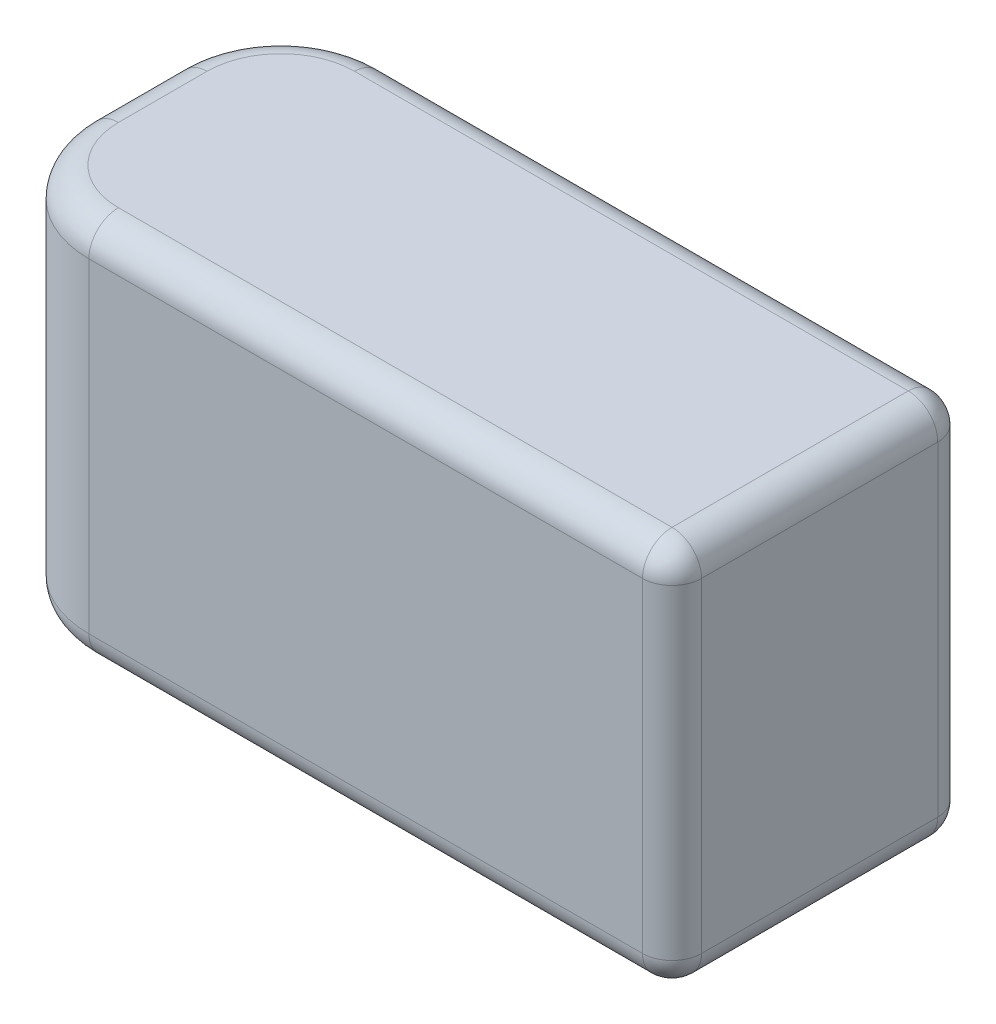
ISO-10303-21;
HEADER;
FILE_DESCRIPTION(('STEP AP214'),'2;1');
FILE_NAME('part.step','',(''),(''),'','','');
FILE_SCHEMA(('AUTOMOTIVE_DESIGN { 1 0 10303 214 1 1 1 1 }'));
ENDSEC;
DATA;
#1=APPLICATION_CONTEXT('core data for automotive mechanical design processes');
#2=APPLICATION_PROTOCOL_DEFINITION('international standard','automotive_design',2000,#1);
#3=PRODUCT_CONTEXT('',#1,'mechanical');
#4=PRODUCT('Part','Part','',(#3));
#5=PRODUCT_RELATED_PRODUCT_CATEGORY('part','',(#4));
#6=PRODUCT_DEFINITION_FORMATION('','',#4);
#7=PRODUCT_DEFINITION_CONTEXT('part definition',#1,'design');
#8=PRODUCT_DEFINITION('design','',#6,#7);
#9=PRODUCT_DEFINITION_SHAPE('','',#8);
#10=(LENGTH_UNIT() NAMED_UNIT(*) SI_UNIT(.MILLI.,.METRE.));
#11=(NAMED_UNIT(*) PLANE_ANGLE_UNIT() SI_UNIT($,.RADIAN.));
#12=(NAMED_UNIT(*) SI_UNIT($,.STERADIAN.) SOLID_ANGLE_UNIT());
#13=UNCERTAINTY_MEASURE_WITH_UNIT(LENGTH_MEASURE(1.E-05),#10,'distance_accuracy_value','');
#14=(GEOMETRIC_REPRESENTATION_CONTEXT(3) GLOBAL_UNCERTAINTY_ASSIGNED_CONTEXT((#13)) GLOBAL_UNIT_ASSIGNED_CONTEXT((#10,
#11,#12)) REPRESENTATION_CONTEXT('',''));
#15=CARTESIAN_POINT('',(0.,0.,0.));
#16=DIRECTION('',(0.,0.,1.));
#17=DIRECTION('',(1.,0.,0.));
#18=AXIS2_PLACEMENT_3D('',#15,#16,#17);
#19=CARTESIAN_POINT('',(23.25,-13.,20.));
#20=DIRECTION('',(-1.,0.,0.));
#21=DIRECTION('',(0.,0.,1.));
#22=AXIS2_PLACEMENT_3D('',#19,#20,#21);
#23=PLANE('',#22);
#24=DIRECTION('',(0.,1.,0.));
#25=VECTOR('',#24,1.);
#26=CARTESIAN_POINT('',(23.25,-13.,18.));
#27=LINE('',#26,#25);
#28=CARTESIAN_POINT('',(23.25,11.,18.));
#29=VERTEX_POINT('',#28);
#30=CARTESIAN_POINT('',(23.25,-11.,18.));
#31=VERTEX_POINT('',#30);
#32=EDGE_CURVE('E258',#29,#31,#27,.F.);
#33=ORIENTED_EDGE('',*,*,#32,.T.);
#34=DIRECTION('',(0.,0.,-1.));
#35=VECTOR('',#34,1.);
#36=CARTESIAN_POINT('',(23.25,-11.,20.));
#37=LINE('',#36,#35);
#38=CARTESIAN_POINT('',(23.25,-11.,2.));
#39=VERTEX_POINT('',#38);
#40=EDGE_CURVE('E260',#31,#39,#37,.T.);
#41=ORIENTED_EDGE('',*,*,#40,.T.);
#42=DIRECTION('',(0.,1.,0.));
#43=VECTOR('',#42,1.);
#44=CARTESIAN_POINT('',(23.25,13.,2.));
#45=LINE('',#44,#43);
#46=CARTESIAN_POINT('',(23.25,11.,2.));
#47=VERTEX_POINT('',#46);
#48=EDGE_CURVE('E254',#39,#47,#45,.T.);
#49=ORIENTED_EDGE('',*,*,#48,.T.);
#50=DIRECTION('',(0.,0.,-1.));
#51=VECTOR('',#50,1.);
#52=CARTESIAN_POINT('',(23.25,11.,20.));
#53=LINE('',#52,#51);
#54=EDGE_CURVE('E256',#47,#29,#53,.F.);
#55=ORIENTED_EDGE('',*,*,#54,.T.);
#56=EDGE_LOOP('',(#33,#41,#49,#55));
#57=FACE_BOUND('',#56,.T.);
#58=ADVANCED_FACE('F38',(#57),#23,.F.);
#59=CARTESIAN_POINT('',(-23.25,13.,20.));
#60=DIRECTION('',(0.,-1.,0.));
#61=DIRECTION('',(0.,0.,-1.));
#62=AXIS2_PLACEMENT_3D('',#59,#60,#61);
#63=PLANE('',#62);
#64=DIRECTION('',(0.,0.,-1.));
#65=VECTOR('',#64,1.);
#66=CARTESIAN_POINT('',(21.25,13.,20.));
#67=LINE('',#66,#65);
#68=CARTESIAN_POINT('',(21.25,13.,18.));
#69=VERTEX_POINT('',#68);
#70=CARTESIAN_POINT('',(21.25,13.,2.));
#71=VERTEX_POINT('',#70);
#72=EDGE_CURVE('E149',#69,#71,#67,.T.);
#73=ORIENTED_EDGE('',*,*,#72,.T.);
#74=DIRECTION('',(-1.,0.,0.));
#75=VECTOR('',#74,1.);
#76=CARTESIAN_POINT('',(-16.25,13.,2.));
#77=LINE('',#76,#75);
#78=CARTESIAN_POINT('',(-16.25,13.,2.));
#79=VERTEX_POINT('',#78);
#80=EDGE_CURVE('E220',#71,#79,#77,.T.);
#81=ORIENTED_EDGE('',*,*,#80,.T.);
#82=CARTESIAN_POINT('',(-16.25,13.,7.));
#83=DIRECTION('',(0.,-1.,0.));
#84=DIRECTION('',(0.,0.,-1.));
#85=AXIS2_PLACEMENT_3D('',#82,#83,#84);
#86=CIRCLE('',#85,5.);
#87=CARTESIAN_POINT('',(-21.25,13.,7.));
#88=VERTEX_POINT('',#87);
#89=EDGE_CURVE('E218',#79,#88,#86,.F.);
#90=ORIENTED_EDGE('',*,*,#89,.T.);
#91=DIRECTION('',(0.,0.,-1.));
#92=VECTOR('',#91,1.);
#93=CARTESIAN_POINT('',(-21.25,13.,20.));
#94=LINE('',#93,#92);
#95=CARTESIAN_POINT('',(-21.25,13.,13.));
#96=VERTEX_POINT('',#95);
#97=EDGE_CURVE('E144',#88,#96,#94,.F.);
#98=ORIENTED_EDGE('',*,*,#97,.T.);
#99=CARTESIAN_POINT('',(-16.25,13.,13.));
#100=DIRECTION('',(0.,-1.,0.));
#101=DIRECTION('',(0.,0.,-1.));
#102=AXIS2_PLACEMENT_3D('',#99,#100,#101);
#103=CIRCLE('',#102,5.);
#104=CARTESIAN_POINT('',(-16.25,13.,18.));
#105=VERTEX_POINT('',#104);
#106=EDGE_CURVE('E138',#96,#105,#103,.F.);
#107=ORIENTED_EDGE('',*,*,#106,.T.);
#108=DIRECTION('',(-1.,0.,0.));
#109=VECTOR('',#108,1.);
#110=CARTESIAN_POINT('',(-23.25,13.,18.));
#111=LINE('',#110,#109);
#112=EDGE_CURVE('E141',#105,#69,#111,.F.);
#113=ORIENTED_EDGE('',*,*,#112,.T.);
#114=EDGE_LOOP('',(#73,#81,#90,#98,#107,#113));
#115=FACE_BOUND('',#114,.T.);
#116=ADVANCED_FACE('F140',(#115),#63,.F.);
#117=CARTESIAN_POINT('',(-23.25,-13.,20.));
#118=DIRECTION('',(1.,0.,0.));
#119=DIRECTION('',(0.,0.,-1.));
#120=AXIS2_PLACEMENT_3D('',#117,#118,#119);
#121=PLANE('',#120);
#122=DIRECTION('',(0.,-1.,0.));
#123=VECTOR('',#122,1.);
#124=CARTESIAN_POINT('',(-23.25,-13.,13.));
#125=LINE('',#124,#123);
#126=CARTESIAN_POINT('',(-23.25,-11.,13.));
#127=VERTEX_POINT('',#126);
#128=CARTESIAN_POINT('',(-23.25,11.,13.));
#129=VERTEX_POINT('',#128);
#130=EDGE_CURVE('E199',#127,#129,#125,.F.);
#131=ORIENTED_EDGE('',*,*,#130,.T.);
#132=DIRECTION('',(0.,0.,-1.));
#133=VECTOR('',#132,1.);
#134=CARTESIAN_POINT('',(-23.25,11.,20.));
#135=LINE('',#134,#133);
#136=CARTESIAN_POINT('',(-23.25,11.,7.));
#137=VERTEX_POINT('',#136);
#138=EDGE_CURVE('E236',#129,#137,#135,.T.);
#139=ORIENTED_EDGE('',*,*,#138,.T.);
#140=DIRECTION('',(0.,-1.,0.));
#141=VECTOR('',#140,1.);
#142=CARTESIAN_POINT('',(-23.25,-13.,7.));
#143=LINE('',#142,#141);
#144=CARTESIAN_POINT('',(-23.25,-11.,7.));
#145=VERTEX_POINT('',#144);
#146=EDGE_CURVE('E205',#137,#145,#143,.T.);
#147=ORIENTED_EDGE('',*,*,#146,.T.);
#148=DIRECTION('',(0.,0.,-1.));
#149=VECTOR('',#148,1.);
#150=CARTESIAN_POINT('',(-23.25,-11.,20.));
#151=LINE('',#150,#149);
#152=EDGE_CURVE('E234',#145,#127,#151,.F.);
#153=ORIENTED_EDGE('',*,*,#152,.T.);
#154=EDGE_LOOP('',(#131,#139,#147,#153));
#155=FACE_BOUND('',#154,.T.);
#156=ADVANCED_FACE('F328',(#155),#121,.F.);
#157=CARTESIAN_POINT('',(-23.25,-13.,20.));
#158=DIRECTION('',(0.,1.,0.));
#159=DIRECTION('',(0.,0.,1.));
#160=AXIS2_PLACEMENT_3D('',#157,#158,#159);
#161=PLANE('',#160);
#162=CARTESIAN_POINT('',(-16.25,-13.,7.));
#163=DIRECTION('',(0.,1.,0.));
#164=DIRECTION('',(0.,0.,1.));
#165=AXIS2_PLACEMENT_3D('',#162,#163,#164);
#166=CIRCLE('',#165,5.);
#167=CARTESIAN_POINT('',(-21.25,-13.,7.));
#168=VERTEX_POINT('',#167);
#169=CARTESIAN_POINT('',(-16.25,-13.,2.));
#170=VERTEX_POINT('',#169);
#171=EDGE_CURVE('E249',#168,#170,#166,.F.);
#172=ORIENTED_EDGE('',*,*,#171,.T.);
#173=DIRECTION('',(1.,0.,0.));
#174=VECTOR('',#173,1.);
#175=CARTESIAN_POINT('',(23.25,-13.,2.));
#176=LINE('',#175,#174);
#177=CARTESIAN_POINT('',(21.25,-13.,2.));
#178=VERTEX_POINT('',#177);
#179=EDGE_CURVE('E251',#170,#178,#176,.T.);
#180=ORIENTED_EDGE('',*,*,#179,.T.);
#181=DIRECTION('',(0.,0.,-1.));
#182=VECTOR('',#181,1.);
#183=CARTESIAN_POINT('',(21.25,-13.,20.));
#184=LINE('',#183,#182);
#185=CARTESIAN_POINT('',(21.25,-13.,18.));
#186=VERTEX_POINT('',#185);
#187=EDGE_CURVE('E243',#178,#186,#184,.F.);
#188=ORIENTED_EDGE('',*,*,#187,.T.);
#189=DIRECTION('',(1.,0.,0.));
#190=VECTOR('',#189,1.);
#191=CARTESIAN_POINT('',(-23.25,-13.,18.));
#192=LINE('',#191,#190);
#193=CARTESIAN_POINT('',(-16.25,-13.,18.));
#194=VERTEX_POINT('',#193);
#195=EDGE_CURVE('E241',#186,#194,#192,.F.);
#196=ORIENTED_EDGE('',*,*,#195,.T.);
#197=CARTESIAN_POINT('',(-16.25,-13.,13.));
#198=DIRECTION('',(0.,1.,0.));
#199=DIRECTION('',(0.,0.,1.));
#200=AXIS2_PLACEMENT_3D('',#197,#198,#199);
#201=CIRCLE('',#200,5.);
#202=CARTESIAN_POINT('',(-21.25,-13.,13.));
#203=VERTEX_POINT('',#202);
#204=EDGE_CURVE('E245',#194,#203,#201,.F.);
#205=ORIENTED_EDGE('',*,*,#204,.T.);
#206=DIRECTION('',(0.,0.,-1.));
#207=VECTOR('',#206,1.);
#208=CARTESIAN_POINT('',(-21.25,-13.,20.));
#209=LINE('',#208,#207);
#210=EDGE_CURVE('E247',#203,#168,#209,.T.);
#211=ORIENTED_EDGE('',*,*,#210,.T.);
#212=EDGE_LOOP('',(#172,#180,#188,#196,#205,#211));
#213=FACE_BOUND('',#212,.T.);
#214=ADVANCED_FACE('F309',(#213),#161,.F.);
#215=CARTESIAN_POINT('',(0.,0.,20.));
#216=DIRECTION('',(0.,0.,-1.));
#217=DIRECTION('',(-1.,0.,0.));
#218=AXIS2_PLACEMENT_3D('',#215,#216,#217);
#219=PLANE('',#218);
#220=DIRECTION('',(0.,1.,0.));
#221=VECTOR('',#220,1.);
#222=CARTESIAN_POINT('',(21.25,0.,20.));
#223=LINE('',#222,#221);
#224=CARTESIAN_POINT('',(21.25,-11.,20.));
#225=VERTEX_POINT('',#224);
#226=CARTESIAN_POINT('',(21.25,11.,20.));
#227=VERTEX_POINT('',#226);
#228=EDGE_CURVE('E47',#225,#227,#223,.T.);
#229=ORIENTED_EDGE('',*,*,#228,.T.);
#230=DIRECTION('',(-1.,0.,0.));
#231=VECTOR('',#230,1.);
#232=CARTESIAN_POINT('',(0.,11.,20.));
#233=LINE('',#232,#231);
#234=CARTESIAN_POINT('',(-16.25,11.,20.));
#235=VERTEX_POINT('',#234);
#236=EDGE_CURVE('E11',#227,#235,#233,.T.);
#237=ORIENTED_EDGE('',*,*,#236,.T.);
#238=DIRECTION('',(0.,-1.,0.));
#239=VECTOR('',#238,1.);
#240=CARTESIAN_POINT('',(-16.25,0.,20.));
#241=LINE('',#240,#239);
#242=CARTESIAN_POINT('',(-16.25,-11.,20.));
#243=VERTEX_POINT('',#242);
#244=EDGE_CURVE('E159',#235,#243,#241,.T.);
#245=ORIENTED_EDGE('',*,*,#244,.T.);
#246=DIRECTION('',(1.,0.,0.));
#247=VECTOR('',#246,1.);
#248=CARTESIAN_POINT('',(0.,-11.,20.));
#249=LINE('',#248,#247);
#250=EDGE_CURVE('E58',#243,#225,#249,.T.);
#251=ORIENTED_EDGE('',*,*,#250,.T.);
#252=EDGE_LOOP('',(#229,#237,#245,#251));
#253=FACE_BOUND('',#252,.T.);
#254=ADVANCED_FACE('F534',(#253),#219,.F.);
#255=CARTESIAN_POINT('',(0.,0.,0.));
#256=DIRECTION('',(0.,0.,-1.));
#257=DIRECTION('',(-1.,0.,0.));
#258=AXIS2_PLACEMENT_3D('',#255,#256,#257);
#259=PLANE('',#258);
#260=DIRECTION('',(0.,-1.,0.));
#261=VECTOR('',#260,1.);
#262=CARTESIAN_POINT('',(-16.25,13.,0.));
#263=LINE('',#262,#261);
#264=CARTESIAN_POINT('',(-16.25,-11.,0.));
#265=VERTEX_POINT('',#264);
#266=CARTESIAN_POINT('',(-16.25,11.,0.));
#267=VERTEX_POINT('',#266);
#268=EDGE_CURVE('E210',#265,#267,#263,.F.);
#269=ORIENTED_EDGE('',*,*,#268,.T.);
#270=DIRECTION('',(-1.,0.,0.));
#271=VECTOR('',#270,1.);
#272=CARTESIAN_POINT('',(23.25,11.,0.));
#273=LINE('',#272,#271);
#274=CARTESIAN_POINT('',(21.25,11.,0.));
#275=VERTEX_POINT('',#274);
#276=EDGE_CURVE('E227',#267,#275,#273,.F.);
#277=ORIENTED_EDGE('',*,*,#276,.T.);
#278=DIRECTION('',(0.,1.,0.));
#279=VECTOR('',#278,1.);
#280=CARTESIAN_POINT('',(21.25,-13.,0.));
#281=LINE('',#280,#279);
#282=CARTESIAN_POINT('',(21.25,-11.,0.));
#283=VERTEX_POINT('',#282);
#284=EDGE_CURVE('E223',#275,#283,#281,.F.);
#285=ORIENTED_EDGE('',*,*,#284,.T.);
#286=DIRECTION('',(1.,0.,0.));
#287=VECTOR('',#286,1.);
#288=CARTESIAN_POINT('',(-16.25,-11.,0.));
#289=LINE('',#288,#287);
#290=EDGE_CURVE('E225',#283,#265,#289,.F.);
#291=ORIENTED_EDGE('',*,*,#290,.T.);
#292=EDGE_LOOP('',(#269,#277,#285,#291));
#293=FACE_BOUND('',#292,.T.);
#294=ADVANCED_FACE('F317',(#293),#259,.T.);
#295=CARTESIAN_POINT('',(-16.25,-13.,7.));
#296=DIRECTION('',(0.,1.,0.));
#297=DIRECTION('',(0.,0.,1.));
#298=AXIS2_PLACEMENT_3D('',#295,#296,#297);
#299=CYLINDRICAL_SURFACE('',#298,7.);
#300=ORIENTED_EDGE('',*,*,#146,.F.);
#301=CARTESIAN_POINT('',(-16.25,11.,7.));
#302=DIRECTION('',(0.,-1.,0.));
#303=DIRECTION('',(0.,0.,-1.));
#304=AXIS2_PLACEMENT_3D('',#301,#302,#303);
#305=CIRCLE('',#304,7.);
#306=EDGE_CURVE('E232',#137,#267,#305,.T.);
#307=ORIENTED_EDGE('',*,*,#306,.T.);
#308=ORIENTED_EDGE('',*,*,#268,.F.);
#309=CARTESIAN_POINT('',(-16.25,-11.,7.));
#310=DIRECTION('',(0.,1.,0.));
#311=DIRECTION('',(0.,0.,1.));
#312=AXIS2_PLACEMENT_3D('',#309,#310,#311);
#313=CIRCLE('',#312,7.);
#314=EDGE_CURVE('E230',#265,#145,#313,.T.);
#315=ORIENTED_EDGE('',*,*,#314,.T.);
#316=EDGE_LOOP('',(#300,#307,#308,#315));
#317=FACE_BOUND('',#316,.T.);
#318=ADVANCED_FACE('F322',(#317),#299,.T.);
#319=CARTESIAN_POINT('',(-16.25,0.,13.));
#320=DIRECTION('',(0.,-1.,0.));
#321=DIRECTION('',(0.,0.,-1.));
#322=AXIS2_PLACEMENT_3D('',#319,#320,#321);
#323=CYLINDRICAL_SURFACE('',#322,7.);
#324=ORIENTED_EDGE('',*,*,#244,.F.);
#325=CARTESIAN_POINT('',(-16.25,11.,13.));
#326=DIRECTION('',(0.,-1.,0.));
#327=DIRECTION('',(0.,0.,-1.));
#328=AXIS2_PLACEMENT_3D('',#325,#326,#327);
#329=CIRCLE('',#328,7.);
#330=EDGE_CURVE('E162',#235,#129,#329,.T.);
#331=ORIENTED_EDGE('',*,*,#330,.T.);
#332=ORIENTED_EDGE('',*,*,#130,.F.);
#333=CARTESIAN_POINT('',(-16.25,-11.,13.));
#334=DIRECTION('',(0.,1.,0.));
#335=DIRECTION('',(0.,0.,1.));
#336=AXIS2_PLACEMENT_3D('',#333,#334,#335);
#337=CIRCLE('',#336,7.);
#338=EDGE_CURVE('E238',#127,#243,#337,.T.);
#339=ORIENTED_EDGE('',*,*,#338,.T.);
#340=EDGE_LOOP('',(#324,#331,#332,#339));
#341=FACE_BOUND('',#340,.T.);
#342=ADVANCED_FACE('F332',(#341),#323,.T.);
#343=CARTESIAN_POINT('',(-16.25,-11.,13.));
#344=DIRECTION('',(0.,1.,0.));
#345=DIRECTION('',(0.,0.,1.));
#346=AXIS2_PLACEMENT_3D('',#343,#344,#345);
#347=TOROIDAL_SURFACE('',#346,5.,2.);
#348=CARTESIAN_POINT('',(-16.25,-11.,18.));
#349=DIRECTION('',(1.,0.,0.));
#350=DIRECTION('',(0.,0.,-1.));
#351=AXIS2_PLACEMENT_3D('',#348,#349,#350);
#352=CIRCLE('',#351,2.);
#353=EDGE_CURVE('E193',#243,#194,#352,.T.);
#354=ORIENTED_EDGE('',*,*,#353,.F.);
#355=ORIENTED_EDGE('',*,*,#338,.F.);
#356=CARTESIAN_POINT('',(-21.25,-11.,13.));
#357=DIRECTION('',(0.,0.,-1.));
#358=DIRECTION('',(-1.,0.,0.));
#359=AXIS2_PLACEMENT_3D('',#356,#357,#358);
#360=CIRCLE('',#359,2.);
#361=EDGE_CURVE('E42',#203,#127,#360,.T.);
#362=ORIENTED_EDGE('',*,*,#361,.F.);
#363=ORIENTED_EDGE('',*,*,#204,.F.);
#364=EDGE_LOOP('',(#354,#355,#362,#363));
#365=FACE_BOUND('',#364,.T.);
#366=ADVANCED_FACE('F40',(#365),#347,.T.);
#367=CARTESIAN_POINT('',(-21.25,-11.,20.));
#368=DIRECTION('',(0.,0.,-1.));
#369=DIRECTION('',(-1.,0.,0.));
#370=AXIS2_PLACEMENT_3D('',#367,#368,#369);
#371=CYLINDRICAL_SURFACE('',#370,2.);
#372=ORIENTED_EDGE('',*,*,#361,.T.);
#373=ORIENTED_EDGE('',*,*,#152,.F.);
#374=CARTESIAN_POINT('',(-21.25,-11.,7.));
#375=DIRECTION('',(0.,0.,-1.));
#376=DIRECTION('',(-1.,0.,0.));
#377=AXIS2_PLACEMENT_3D('',#374,#375,#376);
#378=CIRCLE('',#377,2.);
#379=EDGE_CURVE('E191',#168,#145,#378,.T.);
#380=ORIENTED_EDGE('',*,*,#379,.F.);
#381=ORIENTED_EDGE('',*,*,#210,.F.);
#382=EDGE_LOOP('',(#372,#373,#380,#381));
#383=FACE_BOUND('',#382,.T.);
#384=ADVANCED_FACE('F327',(#383),#371,.T.);
#385=CARTESIAN_POINT('',(0.,-11.,18.));
#386=DIRECTION('',(1.,0.,0.));
#387=DIRECTION('',(0.,0.,-1.));
#388=AXIS2_PLACEMENT_3D('',#385,#386,#387);
#389=CYLINDRICAL_SURFACE('',#388,2.);
#390=ORIENTED_EDGE('',*,*,#353,.T.);
#391=ORIENTED_EDGE('',*,*,#195,.F.);
#392=CARTESIAN_POINT('',(21.25,-11.,18.));
#393=DIRECTION('',(1.,0.,0.));
#394=DIRECTION('',(0.,0.,-1.));
#395=AXIS2_PLACEMENT_3D('',#392,#393,#394);
#396=CIRCLE('',#395,2.);
#397=EDGE_CURVE('E188',#225,#186,#396,.T.);
#398=ORIENTED_EDGE('',*,*,#397,.F.);
#399=ORIENTED_EDGE('',*,*,#250,.F.);
#400=EDGE_LOOP('',(#390,#391,#398,#399));
#401=FACE_BOUND('',#400,.T.);
#402=ADVANCED_FACE('F335',(#401),#389,.T.);
#403=CARTESIAN_POINT('',(-16.25,-11.,7.));
#404=DIRECTION('',(0.,1.,0.));
#405=DIRECTION('',(0.,0.,1.));
#406=AXIS2_PLACEMENT_3D('',#403,#404,#405);
#407=TOROIDAL_SURFACE('',#406,5.,2.);
#408=ORIENTED_EDGE('',*,*,#379,.T.);
#409=ORIENTED_EDGE('',*,*,#314,.F.);
#410=CARTESIAN_POINT('',(-16.25,-11.,2.));
#411=DIRECTION('',(1.,0.,0.));
#412=DIRECTION('',(0.,0.,-1.));
#413=AXIS2_PLACEMENT_3D('',#410,#411,#412);
#414=CIRCLE('',#413,2.);
#415=EDGE_CURVE('E185',#170,#265,#414,.T.);
#416=ORIENTED_EDGE('',*,*,#415,.F.);
#417=ORIENTED_EDGE('',*,*,#171,.F.);
#418=EDGE_LOOP('',(#408,#409,#416,#417));
#419=FACE_BOUND('',#418,.T.);
#420=ADVANCED_FACE('F325',(#419),#407,.T.);
#421=CARTESIAN_POINT('',(21.25,-11.,18.));
#422=DIRECTION('',(0.,0.,1.));
#423=DIRECTION('',(1.,0.,0.));
#424=AXIS2_PLACEMENT_3D('',#421,#422,#423);
#425=SPHERICAL_SURFACE('',#424,2.);
#426=CARTESIAN_POINT('',(21.25,-11.,18.));
#427=DIRECTION('',(0.,-1.,0.));
#428=DIRECTION('',(0.,0.,-1.));
#429=AXIS2_PLACEMENT_3D('',#426,#427,#428);
#430=CIRCLE('',#429,2.);
#431=EDGE_CURVE('E179',#225,#31,#430,.F.);
#432=ORIENTED_EDGE('',*,*,#431,.F.);
#433=ORIENTED_EDGE('',*,*,#397,.T.);
#434=CARTESIAN_POINT('',(21.25,-11.,18.));
#435=DIRECTION('',(0.,0.,1.));
#436=DIRECTION('',(1.,0.,0.));
#437=AXIS2_PLACEMENT_3D('',#434,#435,#436);
#438=CIRCLE('',#437,2.);
#439=EDGE_CURVE('E182',#31,#186,#438,.F.);
#440=ORIENTED_EDGE('',*,*,#439,.F.);
#441=EDGE_LOOP('',(#432,#433,#440));
#442=FACE_BOUND('',#441,.T.);
#443=ADVANCED_FACE('F337',(#442),#425,.T.);
#444=CARTESIAN_POINT('',(-23.25,-11.,2.));
#445=DIRECTION('',(-1.,0.,0.));
#446=DIRECTION('',(0.,0.,1.));
#447=AXIS2_PLACEMENT_3D('',#444,#445,#446);
#448=CYLINDRICAL_SURFACE('',#447,2.);
#449=ORIENTED_EDGE('',*,*,#415,.T.);
#450=ORIENTED_EDGE('',*,*,#290,.F.);
#451=CARTESIAN_POINT('',(21.25,-11.,2.));
#452=DIRECTION('',(1.,0.,0.));
#453=DIRECTION('',(0.,0.,-1.));
#454=AXIS2_PLACEMENT_3D('',#451,#452,#453);
#455=CIRCLE('',#454,2.);
#456=EDGE_CURVE('E176',#178,#283,#455,.T.);
#457=ORIENTED_EDGE('',*,*,#456,.F.);
#458=ORIENTED_EDGE('',*,*,#179,.F.);
#459=EDGE_LOOP('',(#449,#450,#457,#458));
#460=FACE_BOUND('',#459,.T.);
#461=ADVANCED_FACE('F313',(#460),#448,.T.);
#462=CARTESIAN_POINT('',(21.25,-11.,20.));
#463=DIRECTION('',(0.,0.,-1.));
#464=DIRECTION('',(-1.,0.,0.));
#465=AXIS2_PLACEMENT_3D('',#462,#463,#464);
#466=CYLINDRICAL_SURFACE('',#465,2.);
#467=ORIENTED_EDGE('',*,*,#439,.T.);
#468=ORIENTED_EDGE('',*,*,#187,.F.);
#469=CARTESIAN_POINT('',(21.25,-11.,2.));
#470=DIRECTION('',(0.,0.,-1.));
#471=DIRECTION('',(-1.,0.,0.));
#472=AXIS2_PLACEMENT_3D('',#469,#470,#471);
#473=CIRCLE('',#472,2.);
#474=EDGE_CURVE('E174',#39,#178,#473,.T.);
#475=ORIENTED_EDGE('',*,*,#474,.F.);
#476=ORIENTED_EDGE('',*,*,#40,.F.);
#477=EDGE_LOOP('',(#467,#468,#475,#476));
#478=FACE_BOUND('',#477,.T.);
#479=ADVANCED_FACE('F306',(#478),#466,.T.);
#480=CARTESIAN_POINT('',(21.25,0.,18.));
#481=DIRECTION('',(0.,1.,0.));
#482=DIRECTION('',(0.,0.,1.));
#483=AXIS2_PLACEMENT_3D('',#480,#481,#482);
#484=CYLINDRICAL_SURFACE('',#483,2.);
#485=ORIENTED_EDGE('',*,*,#431,.T.);
#486=ORIENTED_EDGE('',*,*,#32,.F.);
#487=CARTESIAN_POINT('',(21.25,11.,18.));
#488=DIRECTION('',(0.,1.,0.));
#489=DIRECTION('',(0.,0.,1.));
#490=AXIS2_PLACEMENT_3D('',#487,#488,#489);
#491=CIRCLE('',#490,2.);
#492=EDGE_CURVE('E165',#227,#29,#491,.T.);
#493=ORIENTED_EDGE('',*,*,#492,.F.);
#494=ORIENTED_EDGE('',*,*,#228,.F.);
#495=EDGE_LOOP('',(#485,#486,#493,#494));
#496=FACE_BOUND('',#495,.T.);
#497=ADVANCED_FACE('F291',(#496),#484,.T.);
#498=CARTESIAN_POINT('',(0.,11.,18.));
#499=DIRECTION('',(-1.,0.,0.));
#500=DIRECTION('',(0.,0.,1.));
#501=AXIS2_PLACEMENT_3D('',#498,#499,#500);
#502=CYLINDRICAL_SURFACE('',#501,2.);
#503=CARTESIAN_POINT('',(-16.25,11.,18.));
#504=DIRECTION('',(-1.,0.,0.));
#505=DIRECTION('',(0.,0.,1.));
#506=AXIS2_PLACEMENT_3D('',#503,#504,#505);
#507=CIRCLE('',#506,2.);
#508=EDGE_CURVE('E154',#235,#105,#507,.T.);
#509=ORIENTED_EDGE('',*,*,#508,.F.);
#510=ORIENTED_EDGE('',*,*,#236,.F.);
#511=CARTESIAN_POINT('',(21.25,11.,18.));
#512=DIRECTION('',(1.,0.,0.));
#513=DIRECTION('',(0.,0.,-1.));
#514=AXIS2_PLACEMENT_3D('',#511,#512,#513);
#515=CIRCLE('',#514,2.);
#516=EDGE_CURVE('E157',#69,#227,#515,.T.);
#517=ORIENTED_EDGE('',*,*,#516,.F.);
#518=ORIENTED_EDGE('',*,*,#112,.F.);
#519=EDGE_LOOP('',(#509,#510,#517,#518));
#520=FACE_BOUND('',#519,.T.);
#521=ADVANCED_FACE('F153',(#520),#502,.T.);
#522=CARTESIAN_POINT('',(21.25,-11.,2.));
#523=DIRECTION('',(0.,0.,1.));
#524=DIRECTION('',(1.,0.,0.));
#525=AXIS2_PLACEMENT_3D('',#522,#523,#524);
#526=SPHERICAL_SURFACE('',#525,2.);
#527=ORIENTED_EDGE('',*,*,#474,.T.);
#528=ORIENTED_EDGE('',*,*,#456,.T.);
#529=CARTESIAN_POINT('',(21.25,-11.,2.));
#530=DIRECTION('',(0.,-1.,0.));
#531=DIRECTION('',(0.,0.,-1.));
#532=AXIS2_PLACEMENT_3D('',#529,#530,#531);
#533=CIRCLE('',#532,2.);
#534=EDGE_CURVE('E163',#39,#283,#533,.F.);
#535=ORIENTED_EDGE('',*,*,#534,.F.);
#536=EDGE_LOOP('',(#527,#528,#535));
#537=FACE_BOUND('',#536,.T.);
#538=ADVANCED_FACE('F302',(#537),#526,.T.);
#539=CARTESIAN_POINT('',(21.25,11.,18.));
#540=DIRECTION('',(0.,0.,1.));
#541=DIRECTION('',(1.,0.,0.));
#542=AXIS2_PLACEMENT_3D('',#539,#540,#541);
#543=SPHERICAL_SURFACE('',#542,2.);
#544=ORIENTED_EDGE('',*,*,#516,.T.);
#545=ORIENTED_EDGE('',*,*,#492,.T.);
#546=CARTESIAN_POINT('',(21.25,11.,18.));
#547=DIRECTION('',(0.,0.,1.));
#548=DIRECTION('',(1.,0.,0.));
#549=AXIS2_PLACEMENT_3D('',#546,#547,#548);
#550=CIRCLE('',#549,2.);
#551=EDGE_CURVE('E168',#69,#29,#550,.F.);
#552=ORIENTED_EDGE('',*,*,#551,.F.);
#553=EDGE_LOOP('',(#544,#545,#552));
#554=FACE_BOUND('',#553,.T.);
#555=ADVANCED_FACE('F287',(#554),#543,.T.);
#556=CARTESIAN_POINT('',(-16.25,11.,13.));
#557=DIRECTION('',(0.,-1.,0.));
#558=DIRECTION('',(0.,0.,-1.));
#559=AXIS2_PLACEMENT_3D('',#556,#557,#558);
#560=TOROIDAL_SURFACE('',#559,5.,2.);
#561=ORIENTED_EDGE('',*,*,#508,.T.);
#562=ORIENTED_EDGE('',*,*,#106,.F.);
#563=CARTESIAN_POINT('',(-21.25,11.,13.));
#564=DIRECTION('',(0.,0.,-1.));
#565=DIRECTION('',(-1.,0.,0.));
#566=AXIS2_PLACEMENT_3D('',#563,#564,#565);
#567=CIRCLE('',#566,2.);
#568=EDGE_CURVE('E278',#129,#96,#567,.T.);
#569=ORIENTED_EDGE('',*,*,#568,.F.);
#570=ORIENTED_EDGE('',*,*,#330,.F.);
#571=EDGE_LOOP('',(#561,#562,#569,#570));
#572=FACE_BOUND('',#571,.T.);
#573=ADVANCED_FACE('F161',(#572),#560,.T.);
#574=CARTESIAN_POINT('',(21.25,-13.,2.));
#575=DIRECTION('',(0.,-1.,0.));
#576=DIRECTION('',(0.,0.,-1.));
#577=AXIS2_PLACEMENT_3D('',#574,#575,#576);
#578=CYLINDRICAL_SURFACE('',#577,2.);
#579=ORIENTED_EDGE('',*,*,#534,.T.);
#580=ORIENTED_EDGE('',*,*,#284,.F.);
#581=CARTESIAN_POINT('',(21.25,11.,2.));
#582=DIRECTION('',(0.,1.,0.));
#583=DIRECTION('',(0.,0.,1.));
#584=AXIS2_PLACEMENT_3D('',#581,#582,#583);
#585=CIRCLE('',#584,2.);
#586=EDGE_CURVE('E275',#47,#275,#585,.T.);
#587=ORIENTED_EDGE('',*,*,#586,.F.);
#588=ORIENTED_EDGE('',*,*,#48,.F.);
#589=EDGE_LOOP('',(#579,#580,#587,#588));
#590=FACE_BOUND('',#589,.T.);
#591=ADVANCED_FACE('F298',(#590),#578,.T.);
#592=CARTESIAN_POINT('',(21.25,11.,20.));
#593=DIRECTION('',(0.,0.,-1.));
#594=DIRECTION('',(-1.,0.,0.));
#595=AXIS2_PLACEMENT_3D('',#592,#593,#594);
#596=CYLINDRICAL_SURFACE('',#595,2.);
#597=ORIENTED_EDGE('',*,*,#551,.T.);
#598=ORIENTED_EDGE('',*,*,#54,.F.);
#599=CARTESIAN_POINT('',(21.25,11.,2.));
#600=DIRECTION('',(0.,0.,-1.));
#601=DIRECTION('',(-1.,0.,0.));
#602=AXIS2_PLACEMENT_3D('',#599,#600,#601);
#603=CIRCLE('',#602,2.);
#604=EDGE_CURVE('E272',#71,#47,#603,.T.);
#605=ORIENTED_EDGE('',*,*,#604,.F.);
#606=ORIENTED_EDGE('',*,*,#72,.F.);
#607=EDGE_LOOP('',(#597,#598,#605,#606));
#608=FACE_BOUND('',#607,.T.);
#609=ADVANCED_FACE('F283',(#608),#596,.T.);
#610=CARTESIAN_POINT('',(-21.25,11.,20.));
#611=DIRECTION('',(0.,0.,-1.));
#612=DIRECTION('',(-1.,0.,0.));
#613=AXIS2_PLACEMENT_3D('',#610,#611,#612);
#614=CYLINDRICAL_SURFACE('',#613,2.);
#615=ORIENTED_EDGE('',*,*,#568,.T.);
#616=ORIENTED_EDGE('',*,*,#97,.F.);
#617=CARTESIAN_POINT('',(-21.25,11.,7.));
#618=DIRECTION('',(0.,0.,-1.));
#619=DIRECTION('',(-1.,0.,0.));
#620=AXIS2_PLACEMENT_3D('',#617,#618,#619);
#621=CIRCLE('',#620,2.);
#622=EDGE_CURVE('E269',#137,#88,#621,.T.);
#623=ORIENTED_EDGE('',*,*,#622,.F.);
#624=ORIENTED_EDGE('',*,*,#138,.F.);
#625=EDGE_LOOP('',(#615,#616,#623,#624));
#626=FACE_BOUND('',#625,.T.);
#627=ADVANCED_FACE('F369',(#626),#614,.T.);
#628=CARTESIAN_POINT('',(21.25,11.,2.));
#629=DIRECTION('',(0.,0.,1.));
#630=DIRECTION('',(1.,0.,0.));
#631=AXIS2_PLACEMENT_3D('',#628,#629,#630);
#632=SPHERICAL_SURFACE('',#631,2.);
#633=ORIENTED_EDGE('',*,*,#604,.T.);
#634=ORIENTED_EDGE('',*,*,#586,.T.);
#635=CARTESIAN_POINT('',(21.25,11.,2.));
#636=DIRECTION('',(1.,0.,0.));
#637=DIRECTION('',(0.,0.,-1.));
#638=AXIS2_PLACEMENT_3D('',#635,#636,#637);
#639=CIRCLE('',#638,2.);
#640=EDGE_CURVE('E267',#71,#275,#639,.F.);
#641=ORIENTED_EDGE('',*,*,#640,.F.);
#642=EDGE_LOOP('',(#633,#634,#641));
#643=FACE_BOUND('',#642,.T.);
#644=ADVANCED_FACE('F365',(#643),#632,.T.);
#645=CARTESIAN_POINT('',(-16.25,11.,7.));
#646=DIRECTION('',(0.,-1.,0.));
#647=DIRECTION('',(0.,0.,-1.));
#648=AXIS2_PLACEMENT_3D('',#645,#646,#647);
#649=TOROIDAL_SURFACE('',#648,5.,2.);
#650=ORIENTED_EDGE('',*,*,#622,.T.);
#651=ORIENTED_EDGE('',*,*,#89,.F.);
#652=CARTESIAN_POINT('',(-16.25,11.,2.));
#653=DIRECTION('',(1.,0.,0.));
#654=DIRECTION('',(0.,0.,-1.));
#655=AXIS2_PLACEMENT_3D('',#652,#653,#654);
#656=CIRCLE('',#655,2.);
#657=EDGE_CURVE('E265',#267,#79,#656,.T.);
#658=ORIENTED_EDGE('',*,*,#657,.F.);
#659=ORIENTED_EDGE('',*,*,#306,.F.);
#660=EDGE_LOOP('',(#650,#651,#658,#659));
#661=FACE_BOUND('',#660,.T.);
#662=ADVANCED_FACE('F361',(#661),#649,.T.);
#663=CARTESIAN_POINT('',(-23.25,11.,2.));
#664=DIRECTION('',(1.,0.,0.));
#665=DIRECTION('',(0.,0.,-1.));
#666=AXIS2_PLACEMENT_3D('',#663,#664,#665);
#667=CYLINDRICAL_SURFACE('',#666,2.);
#668=ORIENTED_EDGE('',*,*,#640,.T.);
#669=ORIENTED_EDGE('',*,*,#276,.F.);
#670=ORIENTED_EDGE('',*,*,#657,.T.);
#671=ORIENTED_EDGE('',*,*,#80,.F.);
#672=EDGE_LOOP('',(#668,#669,#670,#671));
#673=FACE_BOUND('',#672,.T.);
#674=ADVANCED_FACE('F358',(#673),#667,.T.);
#675=CLOSED_SHELL('',(#58,#116,#156,#214,#254,#294,#318,#342,#366,#384,#402,#420,#443,#461,#479,
#497,#521,#538,#555,#573,#591,#609,#627,#644,#662,#674));
#676=MANIFOLD_SOLID_BREP('B2',#675);
#677=ADVANCED_BREP_SHAPE_REPRESENTATION('',(#18,#676),#14);
#678=SHAPE_DEFINITION_REPRESENTATION(#9,#677);
ENDSEC;
END-ISO-10303-21;
